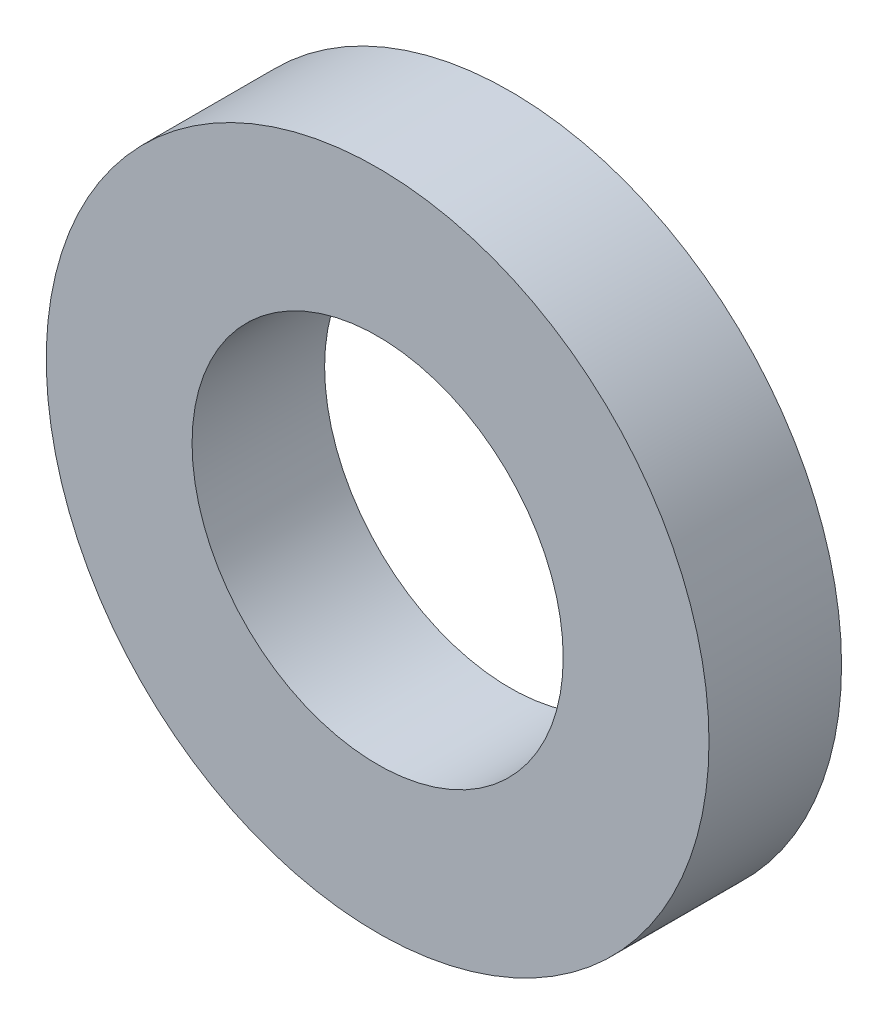
ISO-10303-21;
HEADER;
FILE_DESCRIPTION(('STEP AP214'),'2;1');
FILE_NAME('part.step','',(''),(''),'','','');
FILE_SCHEMA(('AUTOMOTIVE_DESIGN { 1 0 10303 214 1 1 1 1 }'));
ENDSEC;
DATA;
#1=APPLICATION_CONTEXT('core data for automotive mechanical design processes');
#2=APPLICATION_PROTOCOL_DEFINITION('international standard','automotive_design',2000,#1);
#3=PRODUCT_CONTEXT('',#1,'mechanical');
#4=PRODUCT('Part','Part','',(#3));
#5=PRODUCT_RELATED_PRODUCT_CATEGORY('part','',(#4));
#6=PRODUCT_DEFINITION_FORMATION('','',#4);
#7=PRODUCT_DEFINITION_CONTEXT('part definition',#1,'design');
#8=PRODUCT_DEFINITION('design','',#6,#7);
#9=PRODUCT_DEFINITION_SHAPE('','',#8);
#10=(LENGTH_UNIT() NAMED_UNIT(*) SI_UNIT(.MILLI.,.METRE.));
#11=(NAMED_UNIT(*) PLANE_ANGLE_UNIT() SI_UNIT($,.RADIAN.));
#12=(NAMED_UNIT(*) SI_UNIT($,.STERADIAN.) SOLID_ANGLE_UNIT());
#13=UNCERTAINTY_MEASURE_WITH_UNIT(LENGTH_MEASURE(1.E-05),#10,'distance_accuracy_value','');
#14=(GEOMETRIC_REPRESENTATION_CONTEXT(3) GLOBAL_UNCERTAINTY_ASSIGNED_CONTEXT((#13)) GLOBAL_UNIT_ASSIGNED_CONTEXT((#10,
#11,#12)) REPRESENTATION_CONTEXT('',''));
#15=CARTESIAN_POINT('',(0.,0.,0.));
#16=DIRECTION('',(0.,0.,1.));
#17=DIRECTION('',(1.,0.,0.));
#18=AXIS2_PLACEMENT_3D('',#15,#16,#17);
#19=CARTESIAN_POINT('',(0.,0.,10.));
#20=DIRECTION('',(0.,0.,1.));
#21=DIRECTION('',(1.,0.,0.));
#22=AXIS2_PLACEMENT_3D('',#19,#20,#21);
#23=PLANE('',#22);
#24=CARTESIAN_POINT('',(0.,0.,10.));
#25=DIRECTION('',(0.,0.,1.));
#26=DIRECTION('',(1.,0.,0.));
#27=AXIS2_PLACEMENT_3D('',#24,#25,#26);
#28=CIRCLE('',#27,2.5);
#29=CARTESIAN_POINT('',(2.5,0.,10.));
#30=VERTEX_POINT('',#29);
#31=EDGE_CURVE('E10',#30,#30,#28,.T.);
#32=ORIENTED_EDGE('',*,*,#31,.T.);
#33=EDGE_LOOP('',(#32));
#34=FACE_BOUND('',#33,.T.);
#35=CARTESIAN_POINT('',(0.,0.,10.));
#36=DIRECTION('',(0.,0.,1.));
#37=DIRECTION('',(1.,0.,0.));
#38=AXIS2_PLACEMENT_3D('',#35,#36,#37);
#39=CIRCLE('',#38,1.4);
#40=CARTESIAN_POINT('',(1.4,0.,10.));
#41=VERTEX_POINT('',#40);
#42=EDGE_CURVE('E49',#41,#41,#39,.T.);
#43=ORIENTED_EDGE('',*,*,#42,.F.);
#44=EDGE_LOOP('',(#43));
#45=FACE_BOUND('',#44,.T.);
#46=ADVANCED_FACE('F39',(#34,#45),#23,.T.);
#47=CARTESIAN_POINT('',(0.,0.,9.));
#48=DIRECTION('',(0.,0.,1.));
#49=DIRECTION('',(1.,0.,0.));
#50=AXIS2_PLACEMENT_3D('',#47,#48,#49);
#51=PLANE('',#50);
#52=CARTESIAN_POINT('',(0.,0.,9.));
#53=DIRECTION('',(0.,0.,1.));
#54=DIRECTION('',(1.,0.,0.));
#55=AXIS2_PLACEMENT_3D('',#52,#53,#54);
#56=CIRCLE('',#55,2.5);
#57=CARTESIAN_POINT('',(2.5,0.,9.));
#58=VERTEX_POINT('',#57);
#59=EDGE_CURVE('E43',#58,#58,#56,.T.);
#60=ORIENTED_EDGE('',*,*,#59,.F.);
#61=EDGE_LOOP('',(#60));
#62=FACE_BOUND('',#61,.T.);
#63=CARTESIAN_POINT('',(0.,0.,9.));
#64=DIRECTION('',(0.,0.,1.));
#65=DIRECTION('',(1.,0.,0.));
#66=AXIS2_PLACEMENT_3D('',#63,#64,#65);
#67=CIRCLE('',#66,1.4);
#68=CARTESIAN_POINT('',(1.4,0.,9.));
#69=VERTEX_POINT('',#68);
#70=EDGE_CURVE('E55',#69,#69,#67,.T.);
#71=ORIENTED_EDGE('',*,*,#70,.T.);
#72=EDGE_LOOP('',(#71));
#73=FACE_BOUND('',#72,.T.);
#74=ADVANCED_FACE('F64',(#62,#73),#51,.F.);
#75=CARTESIAN_POINT('',(0.,0.,10.));
#76=DIRECTION('',(0.,0.,-1.));
#77=DIRECTION('',(-1.,0.,0.));
#78=AXIS2_PLACEMENT_3D('',#75,#76,#77);
#79=CYLINDRICAL_SURFACE('',#78,2.5);
#80=ORIENTED_EDGE('',*,*,#31,.F.);
#81=EDGE_LOOP('',(#80));
#82=FACE_BOUND('',#81,.T.);
#83=ORIENTED_EDGE('',*,*,#59,.T.);
#84=EDGE_LOOP('',(#83));
#85=FACE_BOUND('',#84,.T.);
#86=ADVANCED_FACE('F41',(#82,#85),#79,.T.);
#87=CARTESIAN_POINT('',(0.,0.,10.));
#88=DIRECTION('',(0.,0.,-1.));
#89=DIRECTION('',(-1.,0.,0.));
#90=AXIS2_PLACEMENT_3D('',#87,#88,#89);
#91=CYLINDRICAL_SURFACE('',#90,1.4);
#92=ORIENTED_EDGE('',*,*,#42,.T.);
#93=EDGE_LOOP('',(#92));
#94=FACE_BOUND('',#93,.T.);
#95=ORIENTED_EDGE('',*,*,#70,.F.);
#96=EDGE_LOOP('',(#95));
#97=FACE_BOUND('',#96,.T.);
#98=ADVANCED_FACE('F59',(#94,#97),#91,.F.);
#99=CLOSED_SHELL('',(#46,#74,#86,#98));
#100=MANIFOLD_SOLID_BREP('B2',#99);
#101=ADVANCED_BREP_SHAPE_REPRESENTATION('',(#18,#100),#14);
#102=SHAPE_DEFINITION_REPRESENTATION(#9,#101);
ENDSEC;
END-ISO-10303-21;
